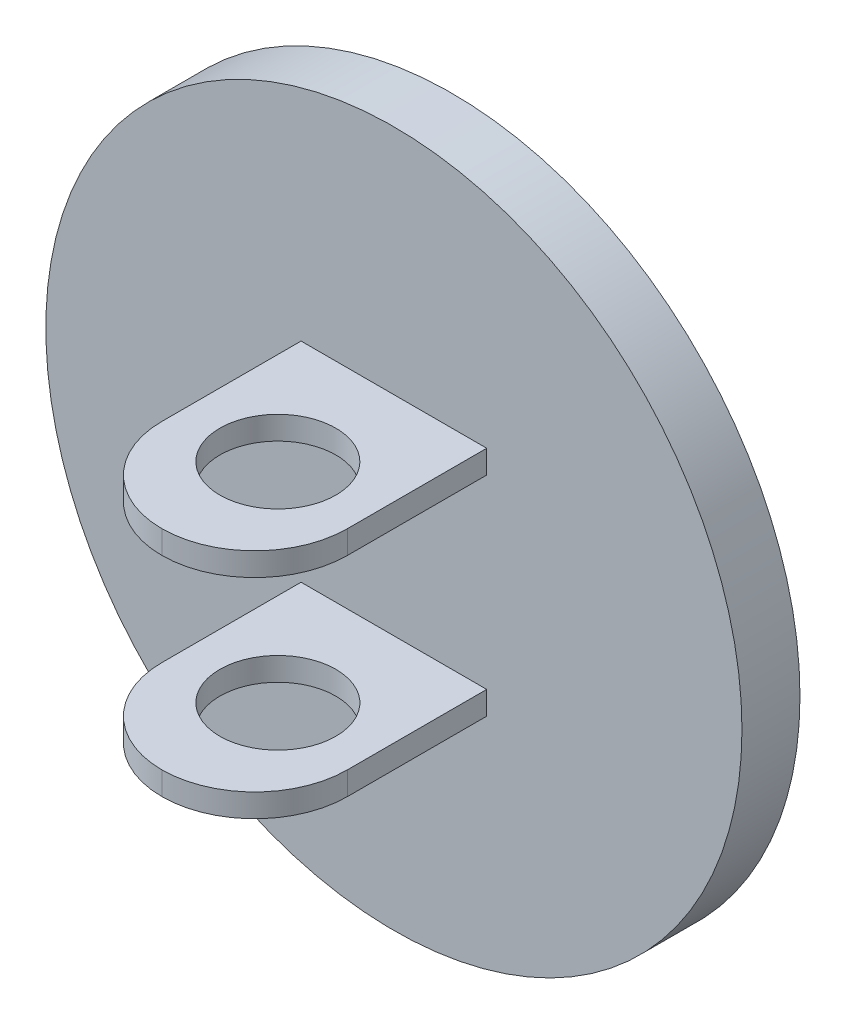
ISO-10303-21;
HEADER;
FILE_DESCRIPTION(('STEP AP214'),'2;1');
FILE_NAME('part.step','',(''),(''),'','','');
FILE_SCHEMA(('AUTOMOTIVE_DESIGN { 1 0 10303 214 1 1 1 1 }'));
ENDSEC;
DATA;
#1=APPLICATION_CONTEXT('core data for automotive mechanical design processes');
#2=APPLICATION_PROTOCOL_DEFINITION('international standard','automotive_design',2000,#1);
#3=PRODUCT_CONTEXT('',#1,'mechanical');
#4=PRODUCT('Part','Part','',(#3));
#5=PRODUCT_RELATED_PRODUCT_CATEGORY('part','',(#4));
#6=PRODUCT_DEFINITION_FORMATION('','',#4);
#7=PRODUCT_DEFINITION_CONTEXT('part definition',#1,'design');
#8=PRODUCT_DEFINITION('design','',#6,#7);
#9=PRODUCT_DEFINITION_SHAPE('','',#8);
#10=(LENGTH_UNIT() NAMED_UNIT(*) SI_UNIT(.MILLI.,.METRE.));
#11=(NAMED_UNIT(*) PLANE_ANGLE_UNIT() SI_UNIT($,.RADIAN.));
#12=(NAMED_UNIT(*) SI_UNIT($,.STERADIAN.) SOLID_ANGLE_UNIT());
#13=UNCERTAINTY_MEASURE_WITH_UNIT(LENGTH_MEASURE(1.E-05),#10,'distance_accuracy_value','');
#14=(GEOMETRIC_REPRESENTATION_CONTEXT(3) GLOBAL_UNCERTAINTY_ASSIGNED_CONTEXT((#13)) GLOBAL_UNIT_ASSIGNED_CONTEXT((#10,
#11,#12)) REPRESENTATION_CONTEXT('',''));
#15=CARTESIAN_POINT('',(0.,0.,0.));
#16=DIRECTION('',(0.,0.,1.));
#17=DIRECTION('',(1.,0.,0.));
#18=AXIS2_PLACEMENT_3D('',#15,#16,#17);
#19=CARTESIAN_POINT('',(0.,0.,60.));
#20=DIRECTION('',(0.,0.,1.));
#21=DIRECTION('',(1.,0.,0.));
#22=AXIS2_PLACEMENT_3D('',#19,#20,#21);
#23=PLANE('',#22);
#24=DIRECTION('',(1.,0.,0.));
#25=VECTOR('',#24,1.);
#26=CARTESIAN_POINT('',(0.,-40.,60.));
#27=LINE('',#26,#25);
#28=CARTESIAN_POINT('',(-40.,-40.,60.));
#29=VERTEX_POINT('',#28);
#30=CARTESIAN_POINT('',(40.,-40.,60.));
#31=VERTEX_POINT('',#30);
#32=EDGE_CURVE('E158',#29,#31,#27,.T.);
#33=ORIENTED_EDGE('',*,*,#32,.T.);
#34=DIRECTION('',(0.,-1.,0.));
#35=VECTOR('',#34,1.);
#36=CARTESIAN_POINT('',(40.,0.,60.));
#37=LINE('',#36,#35);
#38=CARTESIAN_POINT('',(40.,-50.,60.));
#39=VERTEX_POINT('',#38);
#40=EDGE_CURVE('E170',#31,#39,#37,.T.);
#41=ORIENTED_EDGE('',*,*,#40,.T.);
#42=DIRECTION('',(1.,0.,0.));
#43=VECTOR('',#42,1.);
#44=CARTESIAN_POINT('',(0.,-50.,60.));
#45=LINE('',#44,#43);
#46=CARTESIAN_POINT('',(-40.,-50.,60.));
#47=VERTEX_POINT('',#46);
#48=EDGE_CURVE('E166',#47,#39,#45,.T.);
#49=ORIENTED_EDGE('',*,*,#48,.F.);
#50=DIRECTION('',(0.,-1.,0.));
#51=VECTOR('',#50,1.);
#52=CARTESIAN_POINT('',(-40.,0.,60.));
#53=LINE('',#52,#51);
#54=EDGE_CURVE('E162',#29,#47,#53,.T.);
#55=ORIENTED_EDGE('',*,*,#54,.F.);
#56=EDGE_LOOP('',(#33,#41,#49,#55));
#57=FACE_BOUND('',#56,.T.);
#58=CARTESIAN_POINT('',(0.,0.,60.));
#59=DIRECTION('',(0.,0.,1.));
#60=DIRECTION('',(1.,0.,0.));
#61=AXIS2_PLACEMENT_3D('',#58,#59,#60);
#62=CIRCLE('',#61,150.);
#63=CARTESIAN_POINT('',(150.,0.,60.));
#64=VERTEX_POINT('',#63);
#65=EDGE_CURVE('E187',#64,#64,#62,.T.);
#66=ORIENTED_EDGE('',*,*,#65,.T.);
#67=EDGE_LOOP('',(#66));
#68=FACE_BOUND('',#67,.T.);
#69=DIRECTION('',(1.,0.,0.));
#70=VECTOR('',#69,1.);
#71=CARTESIAN_POINT('',(0.,40.,60.));
#72=LINE('',#71,#70);
#73=CARTESIAN_POINT('',(-40.,40.,60.));
#74=VERTEX_POINT('',#73);
#75=CARTESIAN_POINT('',(40.,40.,60.));
#76=VERTEX_POINT('',#75);
#77=EDGE_CURVE('E137',#74,#76,#72,.T.);
#78=ORIENTED_EDGE('',*,*,#77,.F.);
#79=DIRECTION('',(0.,-1.,0.));
#80=VECTOR('',#79,1.);
#81=CARTESIAN_POINT('',(-40.,0.,60.));
#82=LINE('',#81,#80);
#83=CARTESIAN_POINT('',(-40.,50.,60.));
#84=VERTEX_POINT('',#83);
#85=EDGE_CURVE('E125',#84,#74,#82,.T.);
#86=ORIENTED_EDGE('',*,*,#85,.F.);
#87=DIRECTION('',(1.,0.,0.));
#88=VECTOR('',#87,1.);
#89=CARTESIAN_POINT('',(0.,50.,60.));
#90=LINE('',#89,#88);
#91=CARTESIAN_POINT('',(40.,50.,60.));
#92=VERTEX_POINT('',#91);
#93=EDGE_CURVE('E129',#84,#92,#90,.T.);
#94=ORIENTED_EDGE('',*,*,#93,.T.);
#95=DIRECTION('',(0.,-1.,0.));
#96=VECTOR('',#95,1.);
#97=CARTESIAN_POINT('',(40.,0.,60.));
#98=LINE('',#97,#96);
#99=EDGE_CURVE('E144',#92,#76,#98,.T.);
#100=ORIENTED_EDGE('',*,*,#99,.T.);
#101=EDGE_LOOP('',(#78,#86,#94,#100));
#102=FACE_BOUND('',#101,.T.);
#103=ADVANCED_FACE('F45',(#57,#68,#102),#23,.T.);
#104=CARTESIAN_POINT('',(0.,0.,35.));
#105=DIRECTION('',(0.,0.,-1.));
#106=DIRECTION('',(-1.,0.,0.));
#107=AXIS2_PLACEMENT_3D('',#104,#105,#106);
#108=CYLINDRICAL_SURFACE('',#107,25.);
#109=CARTESIAN_POINT('',(0.,0.,35.));
#110=DIRECTION('',(0.,0.,1.));
#111=DIRECTION('',(1.,0.,0.));
#112=AXIS2_PLACEMENT_3D('',#109,#110,#111);
#113=CIRCLE('',#112,25.);
#114=CARTESIAN_POINT('',(25.,0.,35.));
#115=VERTEX_POINT('',#114);
#116=EDGE_CURVE('E195',#115,#115,#113,.T.);
#117=ORIENTED_EDGE('',*,*,#116,.F.);
#118=EDGE_LOOP('',(#117));
#119=FACE_BOUND('',#118,.T.);
#120=CARTESIAN_POINT('',(0.,0.,0.));
#121=DIRECTION('',(0.,0.,1.));
#122=DIRECTION('',(1.,0.,0.));
#123=AXIS2_PLACEMENT_3D('',#120,#121,#122);
#124=CIRCLE('',#123,25.);
#125=CARTESIAN_POINT('',(25.,0.,0.));
#126=VERTEX_POINT('',#125);
#127=EDGE_CURVE('E191',#126,#126,#124,.T.);
#128=ORIENTED_EDGE('',*,*,#127,.T.);
#129=EDGE_LOOP('',(#128));
#130=FACE_BOUND('',#129,.T.);
#131=ADVANCED_FACE('F274',(#119,#130),#108,.T.);
#132=CARTESIAN_POINT('',(0.,0.,0.));
#133=DIRECTION('',(0.,0.,1.));
#134=DIRECTION('',(1.,0.,0.));
#135=AXIS2_PLACEMENT_3D('',#132,#133,#134);
#136=PLANE('',#135);
#137=ORIENTED_EDGE('',*,*,#127,.F.);
#138=EDGE_LOOP('',(#137));
#139=FACE_BOUND('',#138,.T.);
#140=ADVANCED_FACE('F280',(#139),#136,.F.);
#141=CARTESIAN_POINT('',(0.,0.,60.));
#142=DIRECTION('',(0.,0.,-1.));
#143=DIRECTION('',(-1.,0.,0.));
#144=AXIS2_PLACEMENT_3D('',#141,#142,#143);
#145=CYLINDRICAL_SURFACE('',#144,150.);
#146=ORIENTED_EDGE('',*,*,#65,.F.);
#147=EDGE_LOOP('',(#146));
#148=FACE_BOUND('',#147,.T.);
#149=CARTESIAN_POINT('',(0.,0.,35.));
#150=DIRECTION('',(0.,0.,1.));
#151=DIRECTION('',(1.,0.,0.));
#152=AXIS2_PLACEMENT_3D('',#149,#150,#151);
#153=CIRCLE('',#152,150.);
#154=CARTESIAN_POINT('',(150.,0.,35.));
#155=VERTEX_POINT('',#154);
#156=EDGE_CURVE('E186',#155,#155,#153,.T.);
#157=ORIENTED_EDGE('',*,*,#156,.T.);
#158=EDGE_LOOP('',(#157));
#159=FACE_BOUND('',#158,.T.);
#160=ADVANCED_FACE('F291',(#148,#159),#145,.T.);
#161=CARTESIAN_POINT('',(0.,0.,35.));
#162=DIRECTION('',(0.,0.,1.));
#163=DIRECTION('',(1.,0.,0.));
#164=AXIS2_PLACEMENT_3D('',#161,#162,#163);
#165=PLANE('',#164);
#166=ORIENTED_EDGE('',*,*,#116,.T.);
#167=EDGE_LOOP('',(#166));
#168=FACE_BOUND('',#167,.T.);
#169=ORIENTED_EDGE('',*,*,#156,.F.);
#170=EDGE_LOOP('',(#169));
#171=FACE_BOUND('',#170,.T.);
#172=ADVANCED_FACE('F288',(#168,#171),#165,.F.);
#173=CARTESIAN_POINT('',(0.,-40.,160.));
#174=DIRECTION('',(0.,1.,0.));
#175=DIRECTION('',(0.,0.,1.));
#176=AXIS2_PLACEMENT_3D('',#173,#174,#175);
#177=PLANE('',#176);
#178=CARTESIAN_POINT('',(0.,-40.,110.));
#179=DIRECTION('',(0.,1.,0.));
#180=DIRECTION('',(0.,0.,1.));
#181=AXIS2_PLACEMENT_3D('',#178,#179,#180);
#182=CIRCLE('',#181,25.);
#183=CARTESIAN_POINT('',(0.,-40.,135.));
#184=VERTEX_POINT('',#183);
#185=EDGE_CURVE('E139',#184,#184,#182,.T.);
#186=ORIENTED_EDGE('',*,*,#185,.F.);
#187=EDGE_LOOP('',(#186));
#188=FACE_BOUND('',#187,.T.);
#189=CARTESIAN_POINT('',(0.,-40.,120.));
#190=DIRECTION('',(0.,1.,0.));
#191=DIRECTION('',(0.,0.,1.));
#192=AXIS2_PLACEMENT_3D('',#189,#190,#191);
#193=CIRCLE('',#192,40.);
#194=CARTESIAN_POINT('',(-40.,-40.,120.));
#195=VERTEX_POINT('',#194);
#196=CARTESIAN_POINT('',(0.,-40.,160.));
#197=VERTEX_POINT('',#196);
#198=EDGE_CURVE('E218',#195,#197,#193,.T.);
#199=ORIENTED_EDGE('',*,*,#198,.T.);
#200=CARTESIAN_POINT('',(0.,-40.,120.));
#201=DIRECTION('',(0.,1.,0.));
#202=DIRECTION('',(0.,0.,1.));
#203=AXIS2_PLACEMENT_3D('',#200,#201,#202);
#204=CIRCLE('',#203,40.);
#205=CARTESIAN_POINT('',(40.,-40.,120.));
#206=VERTEX_POINT('',#205);
#207=EDGE_CURVE('E221',#197,#206,#204,.T.);
#208=ORIENTED_EDGE('',*,*,#207,.T.);
#209=DIRECTION('',(0.,0.,-1.));
#210=VECTOR('',#209,1.);
#211=CARTESIAN_POINT('',(40.,-40.,160.));
#212=LINE('',#211,#210);
#213=EDGE_CURVE('E174',#206,#31,#212,.T.);
#214=ORIENTED_EDGE('',*,*,#213,.T.);
#215=ORIENTED_EDGE('',*,*,#32,.F.);
#216=DIRECTION('',(0.,0.,-1.));
#217=VECTOR('',#216,1.);
#218=CARTESIAN_POINT('',(-40.,-40.,160.));
#219=LINE('',#218,#217);
#220=EDGE_CURVE('E183',#195,#29,#219,.T.);
#221=ORIENTED_EDGE('',*,*,#220,.F.);
#222=EDGE_LOOP('',(#199,#208,#214,#215,#221));
#223=FACE_BOUND('',#222,.T.);
#224=ADVANCED_FACE('F286',(#188,#223),#177,.T.);
#225=CARTESIAN_POINT('',(-40.,0.,160.));
#226=DIRECTION('',(1.,0.,0.));
#227=DIRECTION('',(0.,1.,0.));
#228=AXIS2_PLACEMENT_3D('',#225,#226,#227);
#229=PLANE('',#228);
#230=DIRECTION('',(0.,0.,-1.));
#231=VECTOR('',#230,1.);
#232=CARTESIAN_POINT('',(-40.,-50.,160.));
#233=LINE('',#232,#231);
#234=CARTESIAN_POINT('',(-40.,-50.,120.));
#235=VERTEX_POINT('',#234);
#236=EDGE_CURVE('E180',#235,#47,#233,.T.);
#237=ORIENTED_EDGE('',*,*,#236,.F.);
#238=DIRECTION('',(0.,-1.,0.));
#239=VECTOR('',#238,1.);
#240=CARTESIAN_POINT('',(-40.,-40.,120.));
#241=LINE('',#240,#239);
#242=EDGE_CURVE('E11',#235,#195,#241,.F.);
#243=ORIENTED_EDGE('',*,*,#242,.T.);
#244=ORIENTED_EDGE('',*,*,#220,.T.);
#245=ORIENTED_EDGE('',*,*,#54,.T.);
#246=EDGE_LOOP('',(#237,#243,#244,#245));
#247=FACE_BOUND('',#246,.T.);
#248=ADVANCED_FACE('F381',(#247),#229,.F.);
#249=CARTESIAN_POINT('',(0.,-50.,160.));
#250=DIRECTION('',(0.,1.,0.));
#251=DIRECTION('',(0.,0.,1.));
#252=AXIS2_PLACEMENT_3D('',#249,#250,#251);
#253=PLANE('',#252);
#254=CARTESIAN_POINT('',(0.,-50.,110.));
#255=DIRECTION('',(0.,-1.,0.));
#256=DIRECTION('',(0.,0.,-1.));
#257=AXIS2_PLACEMENT_3D('',#254,#255,#256);
#258=CIRCLE('',#257,25.);
#259=CARTESIAN_POINT('',(0.,-50.,85.));
#260=VERTEX_POINT('',#259);
#261=EDGE_CURVE('E208',#260,#260,#258,.T.);
#262=ORIENTED_EDGE('',*,*,#261,.F.);
#263=EDGE_LOOP('',(#262));
#264=FACE_BOUND('',#263,.T.);
#265=DIRECTION('',(0.,0.,-1.));
#266=VECTOR('',#265,1.);
#267=CARTESIAN_POINT('',(40.,-50.,160.));
#268=LINE('',#267,#266);
#269=CARTESIAN_POINT('',(40.,-50.,120.));
#270=VERTEX_POINT('',#269);
#271=EDGE_CURVE('E177',#270,#39,#268,.T.);
#272=ORIENTED_EDGE('',*,*,#271,.F.);
#273=CARTESIAN_POINT('',(0.,-50.,120.));
#274=DIRECTION('',(0.,1.,0.));
#275=DIRECTION('',(0.,0.,1.));
#276=AXIS2_PLACEMENT_3D('',#273,#274,#275);
#277=CIRCLE('',#276,40.);
#278=CARTESIAN_POINT('',(0.,-50.,160.));
#279=VERTEX_POINT('',#278);
#280=EDGE_CURVE('E215',#270,#279,#277,.F.);
#281=ORIENTED_EDGE('',*,*,#280,.T.);
#282=CARTESIAN_POINT('',(0.,-50.,120.));
#283=DIRECTION('',(0.,1.,0.));
#284=DIRECTION('',(0.,0.,1.));
#285=AXIS2_PLACEMENT_3D('',#282,#283,#284);
#286=CIRCLE('',#285,40.);
#287=EDGE_CURVE('E212',#279,#235,#286,.F.);
#288=ORIENTED_EDGE('',*,*,#287,.T.);
#289=ORIENTED_EDGE('',*,*,#236,.T.);
#290=ORIENTED_EDGE('',*,*,#48,.T.);
#291=EDGE_LOOP('',(#272,#281,#288,#289,#290));
#292=FACE_BOUND('',#291,.T.);
#293=ADVANCED_FACE('F370',(#264,#292),#253,.F.);
#294=CARTESIAN_POINT('',(40.,0.,160.));
#295=DIRECTION('',(1.,0.,0.));
#296=DIRECTION('',(0.,1.,0.));
#297=AXIS2_PLACEMENT_3D('',#294,#295,#296);
#298=PLANE('',#297);
#299=ORIENTED_EDGE('',*,*,#213,.F.);
#300=DIRECTION('',(0.,-1.,0.));
#301=VECTOR('',#300,1.);
#302=CARTESIAN_POINT('',(40.,0.,120.));
#303=LINE('',#302,#301);
#304=EDGE_CURVE('E199',#206,#270,#303,.T.);
#305=ORIENTED_EDGE('',*,*,#304,.T.);
#306=ORIENTED_EDGE('',*,*,#271,.T.);
#307=ORIENTED_EDGE('',*,*,#40,.F.);
#308=EDGE_LOOP('',(#299,#305,#306,#307));
#309=FACE_BOUND('',#308,.T.);
#310=ADVANCED_FACE('F360',(#309),#298,.T.);
#311=CARTESIAN_POINT('',(-40.,0.,160.));
#312=DIRECTION('',(1.,0.,0.));
#313=DIRECTION('',(0.,1.,0.));
#314=AXIS2_PLACEMENT_3D('',#311,#312,#313);
#315=PLANE('',#314);
#316=DIRECTION('',(0.,0.,-1.));
#317=VECTOR('',#316,1.);
#318=CARTESIAN_POINT('',(-40.,40.,160.));
#319=LINE('',#318,#317);
#320=CARTESIAN_POINT('',(-40.,40.,120.));
#321=VERTEX_POINT('',#320);
#322=EDGE_CURVE('E155',#321,#74,#319,.T.);
#323=ORIENTED_EDGE('',*,*,#322,.F.);
#324=DIRECTION('',(0.,-1.,0.));
#325=VECTOR('',#324,1.);
#326=CARTESIAN_POINT('',(-40.,50.,120.));
#327=LINE('',#326,#325);
#328=CARTESIAN_POINT('',(-40.,50.,120.));
#329=VERTEX_POINT('',#328);
#330=EDGE_CURVE('E55',#321,#329,#327,.F.);
#331=ORIENTED_EDGE('',*,*,#330,.T.);
#332=DIRECTION('',(0.,0.,-1.));
#333=VECTOR('',#332,1.);
#334=CARTESIAN_POINT('',(-40.,50.,160.));
#335=LINE('',#334,#333);
#336=EDGE_CURVE('E122',#329,#84,#335,.T.);
#337=ORIENTED_EDGE('',*,*,#336,.T.);
#338=ORIENTED_EDGE('',*,*,#85,.T.);
#339=EDGE_LOOP('',(#323,#331,#337,#338));
#340=FACE_BOUND('',#339,.T.);
#341=ADVANCED_FACE('F124',(#340),#315,.F.);
#342=CARTESIAN_POINT('',(0.,40.,160.));
#343=DIRECTION('',(0.,1.,0.));
#344=DIRECTION('',(0.,0.,1.));
#345=AXIS2_PLACEMENT_3D('',#342,#343,#344);
#346=PLANE('',#345);
#347=CARTESIAN_POINT('',(0.,40.,110.));
#348=DIRECTION('',(0.,1.,0.));
#349=DIRECTION('',(0.,0.,1.));
#350=AXIS2_PLACEMENT_3D('',#347,#348,#349);
#351=CIRCLE('',#350,25.);
#352=CARTESIAN_POINT('',(0.,40.,135.));
#353=VERTEX_POINT('',#352);
#354=EDGE_CURVE('E207',#353,#353,#351,.T.);
#355=ORIENTED_EDGE('',*,*,#354,.T.);
#356=EDGE_LOOP('',(#355));
#357=FACE_BOUND('',#356,.T.);
#358=DIRECTION('',(0.,0.,-1.));
#359=VECTOR('',#358,1.);
#360=CARTESIAN_POINT('',(40.,40.,160.));
#361=LINE('',#360,#359);
#362=CARTESIAN_POINT('',(40.,40.,120.));
#363=VERTEX_POINT('',#362);
#364=EDGE_CURVE('E152',#363,#76,#361,.T.);
#365=ORIENTED_EDGE('',*,*,#364,.F.);
#366=CARTESIAN_POINT('',(0.,40.,120.));
#367=DIRECTION('',(0.,1.,0.));
#368=DIRECTION('',(0.,0.,1.));
#369=AXIS2_PLACEMENT_3D('',#366,#367,#368);
#370=CIRCLE('',#369,40.);
#371=CARTESIAN_POINT('',(0.,40.,160.));
#372=VERTEX_POINT('',#371);
#373=EDGE_CURVE('E231',#363,#372,#370,.F.);
#374=ORIENTED_EDGE('',*,*,#373,.T.);
#375=CARTESIAN_POINT('',(0.,40.,120.));
#376=DIRECTION('',(0.,1.,0.));
#377=DIRECTION('',(0.,0.,1.));
#378=AXIS2_PLACEMENT_3D('',#375,#376,#377);
#379=CIRCLE('',#378,40.);
#380=EDGE_CURVE('E228',#372,#321,#379,.F.);
#381=ORIENTED_EDGE('',*,*,#380,.T.);
#382=ORIENTED_EDGE('',*,*,#322,.T.);
#383=ORIENTED_EDGE('',*,*,#77,.T.);
#384=EDGE_LOOP('',(#365,#374,#381,#382,#383));
#385=FACE_BOUND('',#384,.T.);
#386=ADVANCED_FACE('F259',(#357,#385),#346,.F.);
#387=CARTESIAN_POINT('',(40.,0.,160.));
#388=DIRECTION('',(1.,0.,0.));
#389=DIRECTION('',(0.,1.,0.));
#390=AXIS2_PLACEMENT_3D('',#387,#388,#389);
#391=PLANE('',#390);
#392=DIRECTION('',(0.,0.,-1.));
#393=VECTOR('',#392,1.);
#394=CARTESIAN_POINT('',(40.,50.,160.));
#395=LINE('',#394,#393);
#396=CARTESIAN_POINT('',(40.,50.,120.));
#397=VERTEX_POINT('',#396);
#398=EDGE_CURVE('E128',#397,#92,#395,.T.);
#399=ORIENTED_EDGE('',*,*,#398,.F.);
#400=DIRECTION('',(0.,-1.,0.));
#401=VECTOR('',#400,1.);
#402=CARTESIAN_POINT('',(40.,0.,120.));
#403=LINE('',#402,#401);
#404=EDGE_CURVE('E224',#397,#363,#403,.T.);
#405=ORIENTED_EDGE('',*,*,#404,.T.);
#406=ORIENTED_EDGE('',*,*,#364,.T.);
#407=ORIENTED_EDGE('',*,*,#99,.F.);
#408=EDGE_LOOP('',(#399,#405,#406,#407));
#409=FACE_BOUND('',#408,.T.);
#410=ADVANCED_FACE('F261',(#409),#391,.T.);
#411=CARTESIAN_POINT('',(0.,50.,160.));
#412=DIRECTION('',(0.,1.,0.));
#413=DIRECTION('',(0.,0.,1.));
#414=AXIS2_PLACEMENT_3D('',#411,#412,#413);
#415=PLANE('',#414);
#416=CARTESIAN_POINT('',(0.,50.,110.));
#417=DIRECTION('',(0.,1.,0.));
#418=DIRECTION('',(0.,0.,1.));
#419=AXIS2_PLACEMENT_3D('',#416,#417,#418);
#420=CIRCLE('',#419,25.);
#421=CARTESIAN_POINT('',(0.,50.,135.));
#422=VERTEX_POINT('',#421);
#423=EDGE_CURVE('E203',#422,#422,#420,.T.);
#424=ORIENTED_EDGE('',*,*,#423,.F.);
#425=EDGE_LOOP('',(#424));
#426=FACE_BOUND('',#425,.T.);
#427=CARTESIAN_POINT('',(0.,50.,120.));
#428=DIRECTION('',(0.,1.,0.));
#429=DIRECTION('',(0.,0.,1.));
#430=AXIS2_PLACEMENT_3D('',#427,#428,#429);
#431=CIRCLE('',#430,40.);
#432=CARTESIAN_POINT('',(0.,50.,160.));
#433=VERTEX_POINT('',#432);
#434=EDGE_CURVE('E63',#329,#433,#431,.T.);
#435=ORIENTED_EDGE('',*,*,#434,.T.);
#436=CARTESIAN_POINT('',(0.,50.,120.));
#437=DIRECTION('',(0.,1.,0.));
#438=DIRECTION('',(0.,0.,1.));
#439=AXIS2_PLACEMENT_3D('',#436,#437,#438);
#440=CIRCLE('',#439,40.);
#441=EDGE_CURVE('E236',#433,#397,#440,.T.);
#442=ORIENTED_EDGE('',*,*,#441,.T.);
#443=ORIENTED_EDGE('',*,*,#398,.T.);
#444=ORIENTED_EDGE('',*,*,#93,.F.);
#445=ORIENTED_EDGE('',*,*,#336,.F.);
#446=EDGE_LOOP('',(#435,#442,#443,#444,#445));
#447=FACE_BOUND('',#446,.T.);
#448=ADVANCED_FACE('F141',(#426,#447),#415,.T.);
#449=CARTESIAN_POINT('',(0.,150.,110.));
#450=DIRECTION('',(0.,-1.,0.));
#451=DIRECTION('',(0.,0.,-1.));
#452=AXIS2_PLACEMENT_3D('',#449,#450,#451);
#453=CYLINDRICAL_SURFACE('',#452,25.);
#454=ORIENTED_EDGE('',*,*,#423,.T.);
#455=EDGE_LOOP('',(#454));
#456=FACE_BOUND('',#455,.T.);
#457=ORIENTED_EDGE('',*,*,#354,.F.);
#458=EDGE_LOOP('',(#457));
#459=FACE_BOUND('',#458,.T.);
#460=ADVANCED_FACE('F268',(#456,#459),#453,.F.);
#461=ORIENTED_EDGE('',*,*,#185,.T.);
#462=EDGE_LOOP('',(#461));
#463=FACE_BOUND('',#462,.T.);
#464=ORIENTED_EDGE('',*,*,#261,.T.);
#465=EDGE_LOOP('',(#464));
#466=FACE_BOUND('',#465,.T.);
#467=ADVANCED_FACE('F304',(#463,#466),#453,.F.);
#468=CARTESIAN_POINT('',(0.,0.,120.));
#469=DIRECTION('',(0.,1.,0.));
#470=DIRECTION('',(-1.,0.,0.));
#471=AXIS2_PLACEMENT_3D('',#468,#469,#470);
#472=CYLINDRICAL_SURFACE('',#471,40.);
#473=DIRECTION('',(0.,-1.,0.));
#474=VECTOR('',#473,1.);
#475=CARTESIAN_POINT('',(0.,-50.,160.));
#476=LINE('',#475,#474);
#477=EDGE_CURVE('E240',#197,#279,#476,.T.);
#478=ORIENTED_EDGE('',*,*,#477,.F.);
#479=ORIENTED_EDGE('',*,*,#198,.F.);
#480=ORIENTED_EDGE('',*,*,#242,.F.);
#481=ORIENTED_EDGE('',*,*,#287,.F.);
#482=EDGE_LOOP('',(#478,#479,#480,#481));
#483=FACE_BOUND('',#482,.T.);
#484=ADVANCED_FACE('F302',(#483),#472,.T.);
#485=CARTESIAN_POINT('',(0.,0.,120.));
#486=DIRECTION('',(0.,-1.,0.));
#487=DIRECTION('',(1.,0.,0.));
#488=AXIS2_PLACEMENT_3D('',#485,#486,#487);
#489=CYLINDRICAL_SURFACE('',#488,40.);
#490=ORIENTED_EDGE('',*,*,#207,.F.);
#491=ORIENTED_EDGE('',*,*,#477,.T.);
#492=ORIENTED_EDGE('',*,*,#280,.F.);
#493=ORIENTED_EDGE('',*,*,#304,.F.);
#494=EDGE_LOOP('',(#490,#491,#492,#493));
#495=FACE_BOUND('',#494,.T.);
#496=ADVANCED_FACE('F299',(#495),#489,.T.);
#497=CARTESIAN_POINT('',(0.,0.,120.));
#498=DIRECTION('',(0.,1.,0.));
#499=DIRECTION('',(-1.,0.,0.));
#500=AXIS2_PLACEMENT_3D('',#497,#498,#499);
#501=CYLINDRICAL_SURFACE('',#500,40.);
#502=DIRECTION('',(0.,-1.,0.));
#503=VECTOR('',#502,1.);
#504=CARTESIAN_POINT('',(0.,40.,160.));
#505=LINE('',#504,#503);
#506=EDGE_CURVE('E49',#433,#372,#505,.T.);
#507=ORIENTED_EDGE('',*,*,#506,.F.);
#508=ORIENTED_EDGE('',*,*,#434,.F.);
#509=ORIENTED_EDGE('',*,*,#330,.F.);
#510=ORIENTED_EDGE('',*,*,#380,.F.);
#511=EDGE_LOOP('',(#507,#508,#509,#510));
#512=FACE_BOUND('',#511,.T.);
#513=ADVANCED_FACE('F47',(#512),#501,.T.);
#514=CARTESIAN_POINT('',(0.,0.,120.));
#515=DIRECTION('',(0.,-1.,0.));
#516=DIRECTION('',(1.,0.,0.));
#517=AXIS2_PLACEMENT_3D('',#514,#515,#516);
#518=CYLINDRICAL_SURFACE('',#517,40.);
#519=ORIENTED_EDGE('',*,*,#441,.F.);
#520=ORIENTED_EDGE('',*,*,#506,.T.);
#521=ORIENTED_EDGE('',*,*,#373,.F.);
#522=ORIENTED_EDGE('',*,*,#404,.F.);
#523=EDGE_LOOP('',(#519,#520,#521,#522));
#524=FACE_BOUND('',#523,.T.);
#525=ADVANCED_FACE('F253',(#524),#518,.T.);
#526=CLOSED_SHELL('',(#103,#131,#140,#160,#172,#224,#248,#293,#310,#341,#386,#410,#448,#460,
#467,#484,#496,#513,#525));
#527=MANIFOLD_SOLID_BREP('B2',#526);
#528=ADVANCED_BREP_SHAPE_REPRESENTATION('',(#18,#527),#14);
#529=SHAPE_DEFINITION_REPRESENTATION(#9,#528);
ENDSEC;
END-ISO-10303-21;
